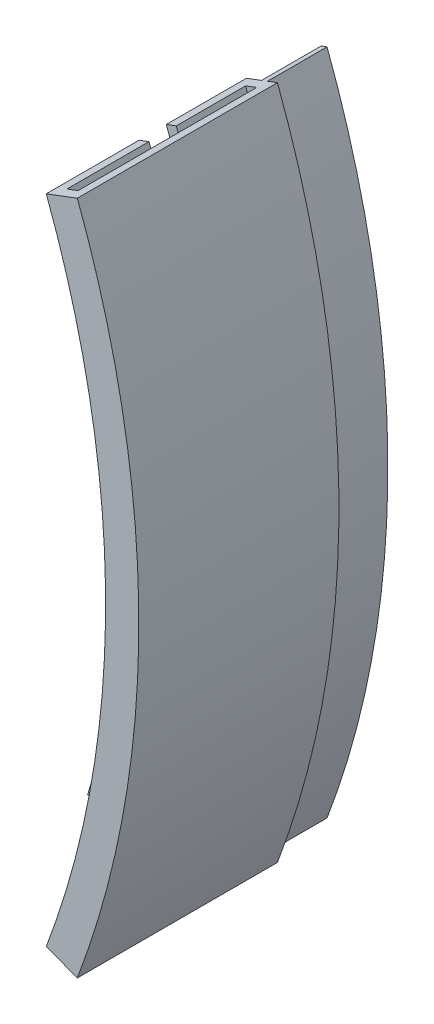
ISO-10303-21;
HEADER;
FILE_DESCRIPTION(('STEP AP214'),'2;1');
FILE_NAME('part.step','',(''),(''),'','','');
FILE_SCHEMA(('AUTOMOTIVE_DESIGN { 1 0 10303 214 1 1 1 1 }'));
ENDSEC;
DATA;
#1=APPLICATION_CONTEXT('core data for automotive mechanical design processes');
#2=APPLICATION_PROTOCOL_DEFINITION('international standard','automotive_design',2000,#1);
#3=PRODUCT_CONTEXT('',#1,'mechanical');
#4=PRODUCT('Part','Part','',(#3));
#5=PRODUCT_RELATED_PRODUCT_CATEGORY('part','',(#4));
#6=PRODUCT_DEFINITION_FORMATION('','',#4);
#7=PRODUCT_DEFINITION_CONTEXT('part definition',#1,'design');
#8=PRODUCT_DEFINITION('design','',#6,#7);
#9=PRODUCT_DEFINITION_SHAPE('','',#8);
#10=(LENGTH_UNIT() NAMED_UNIT(*) SI_UNIT(.MILLI.,.METRE.));
#11=(NAMED_UNIT(*) PLANE_ANGLE_UNIT() SI_UNIT($,.RADIAN.));
#12=(NAMED_UNIT(*) SI_UNIT($,.STERADIAN.) SOLID_ANGLE_UNIT());
#13=UNCERTAINTY_MEASURE_WITH_UNIT(LENGTH_MEASURE(1.E-05),#10,'distance_accuracy_value','');
#14=(GEOMETRIC_REPRESENTATION_CONTEXT(3) GLOBAL_UNCERTAINTY_ASSIGNED_CONTEXT((#13)) GLOBAL_UNIT_ASSIGNED_CONTEXT((#10,
#11,#12)) REPRESENTATION_CONTEXT('',''));
#15=CARTESIAN_POINT('',(0.,0.,0.));
#16=DIRECTION('',(0.,0.,1.));
#17=DIRECTION('',(1.,0.,0.));
#18=AXIS2_PLACEMENT_3D('',#15,#16,#17);
#19=CARTESIAN_POINT('',(210.,0.,72.79));
#20=DIRECTION('',(0.,0.,1.));
#21=DIRECTION('',(1.,0.,0.));
#22=AXIS2_PLACEMENT_3D('',#19,#20,#21);
#23=CYLINDRICAL_SURFACE('',#22,1.7);
#24=DIRECTION('',(0.,0.,1.));
#25=VECTOR('',#24,1.);
#26=CARTESIAN_POINT('',(211.7,0.,72.79));
#27=LINE('',#26,#25);
#28=CARTESIAN_POINT('',(211.7,0.,73.));
#29=VERTEX_POINT('',#28);
#30=CARTESIAN_POINT('',(211.7,0.,76.));
#31=VERTEX_POINT('',#30);
#32=EDGE_CURVE('E9',#29,#31,#27,.T.);
#33=ORIENTED_EDGE('',*,*,#32,.F.);
#34=CARTESIAN_POINT('',(210.,0.,73.));
#35=DIRECTION('',(0.,0.,1.));
#36=DIRECTION('',(1.,0.,0.));
#37=AXIS2_PLACEMENT_3D('',#34,#35,#36);
#38=CIRCLE('',#37,1.7);
#39=EDGE_CURVE('E402',#29,#29,#38,.T.);
#40=ORIENTED_EDGE('',*,*,#39,.F.);
#41=ORIENTED_EDGE('',*,*,#32,.T.);
#42=CARTESIAN_POINT('',(210.,0.,76.));
#43=DIRECTION('',(0.,0.,1.));
#44=DIRECTION('',(1.,0.,0.));
#45=AXIS2_PLACEMENT_3D('',#42,#43,#44);
#46=CIRCLE('',#45,1.7);
#47=EDGE_CURVE('E260',#31,#31,#46,.T.);
#48=ORIENTED_EDGE('',*,*,#47,.T.);
#49=EDGE_LOOP('',(#33,#40,#41,#48));
#50=FACE_BOUND('',#49,.T.);
#51=ADVANCED_FACE('F14',(#50),#23,.F.);
#52=CARTESIAN_POINT('',(202.22303845515,56.620161762074,72.79));
#53=DIRECTION('',(0.,0.,1.));
#54=DIRECTION('',(1.,0.,0.));
#55=AXIS2_PLACEMENT_3D('',#52,#53,#54);
#56=CYLINDRICAL_SURFACE('',#55,1.7);
#57=DIRECTION('',(0.,0.,1.));
#58=VECTOR('',#57,1.);
#59=CARTESIAN_POINT('',(203.92303845515,56.620161762074,72.79));
#60=LINE('',#59,#58);
#61=CARTESIAN_POINT('',(203.92303845515,56.620161762074,73.));
#62=VERTEX_POINT('',#61);
#63=CARTESIAN_POINT('',(203.92303845515,56.620161762074,76.));
#64=VERTEX_POINT('',#63);
#65=EDGE_CURVE('E24',#62,#64,#60,.T.);
#66=ORIENTED_EDGE('',*,*,#65,.F.);
#67=CARTESIAN_POINT('',(202.22303845515,56.620161762074,73.));
#68=DIRECTION('',(0.,0.,1.));
#69=DIRECTION('',(1.,0.,0.));
#70=AXIS2_PLACEMENT_3D('',#67,#68,#69);
#71=CIRCLE('',#70,1.7);
#72=EDGE_CURVE('E334',#62,#62,#71,.T.);
#73=ORIENTED_EDGE('',*,*,#72,.F.);
#74=ORIENTED_EDGE('',*,*,#65,.T.);
#75=CARTESIAN_POINT('',(202.22303845515,56.620161762074,76.));
#76=DIRECTION('',(0.,0.,1.));
#77=DIRECTION('',(1.,0.,0.));
#78=AXIS2_PLACEMENT_3D('',#75,#76,#77);
#79=CIRCLE('',#78,1.7);
#80=EDGE_CURVE('E305',#64,#64,#79,.T.);
#81=ORIENTED_EDGE('',*,*,#80,.T.);
#82=EDGE_LOOP('',(#66,#73,#74,#81));
#83=FACE_BOUND('',#82,.T.);
#84=ADVANCED_FACE('F851',(#83),#56,.F.);
#85=CARTESIAN_POINT('',(202.22303845515,-56.62016176207,72.79));
#86=DIRECTION('',(0.,0.,1.));
#87=DIRECTION('',(1.,0.,0.));
#88=AXIS2_PLACEMENT_3D('',#85,#86,#87);
#89=CYLINDRICAL_SURFACE('',#88,1.7);
#90=DIRECTION('',(0.,0.,1.));
#91=VECTOR('',#90,1.);
#92=CARTESIAN_POINT('',(203.92303845515,-56.62016176207,72.79));
#93=LINE('',#92,#91);
#94=CARTESIAN_POINT('',(203.92303845515,-56.62016176207,73.));
#95=VERTEX_POINT('',#94);
#96=CARTESIAN_POINT('',(203.92303845515,-56.62016176207,76.));
#97=VERTEX_POINT('',#96);
#98=EDGE_CURVE('E331',#95,#97,#93,.T.);
#99=ORIENTED_EDGE('',*,*,#98,.F.);
#100=CARTESIAN_POINT('',(202.22303845515,-56.62016176207,73.));
#101=DIRECTION('',(0.,0.,1.));
#102=DIRECTION('',(1.,0.,0.));
#103=AXIS2_PLACEMENT_3D('',#100,#101,#102);
#104=CIRCLE('',#103,1.7);
#105=EDGE_CURVE('E259',#95,#95,#104,.T.);
#106=ORIENTED_EDGE('',*,*,#105,.F.);
#107=ORIENTED_EDGE('',*,*,#98,.T.);
#108=CARTESIAN_POINT('',(202.22303845515,-56.62016176207,76.));
#109=DIRECTION('',(0.,0.,1.));
#110=DIRECTION('',(1.,0.,0.));
#111=AXIS2_PLACEMENT_3D('',#108,#109,#110);
#112=CIRCLE('',#111,1.7);
#113=EDGE_CURVE('E308',#97,#97,#112,.T.);
#114=ORIENTED_EDGE('',*,*,#113,.T.);
#115=EDGE_LOOP('',(#99,#106,#107,#114));
#116=FACE_BOUND('',#115,.T.);
#117=ADVANCED_FACE('F859',(#116),#89,.F.);
#118=CARTESIAN_POINT('',(0.,0.,76.));
#119=DIRECTION('',(0.,0.,-1.));
#120=DIRECTION('',(0.955579041061321,-0.294734959386099,0.));
#121=AXIS2_PLACEMENT_3D('',#118,#119,#120);
#122=CYLINDRICAL_SURFACE('',#121,203.);
#123=CARTESIAN_POINT('',(0.,0.,76.));
#124=DIRECTION('',(0.,0.,1.));
#125=DIRECTION('',(0.955579041061321,-0.294734959386099,0.));
#126=AXIS2_PLACEMENT_3D('',#123,#124,#125);
#127=CIRCLE('',#126,203.);
#128=CARTESIAN_POINT('',(193.98254533545,-59.83119675535,76.));
#129=VERTEX_POINT('',#128);
#130=CARTESIAN_POINT('',(193.98254533545,59.831196755358,76.));
#131=VERTEX_POINT('',#130);
#132=EDGE_CURVE('E270',#129,#131,#127,.T.);
#133=ORIENTED_EDGE('',*,*,#132,.T.);
#134=DIRECTION('',(0.,0.,-1.));
#135=VECTOR('',#134,1.);
#136=CARTESIAN_POINT('',(193.98254533545,59.831196755358,76.));
#137=LINE('',#136,#135);
#138=CARTESIAN_POINT('',(193.98254533545,59.831196755358,73.));
#139=VERTEX_POINT('',#138);
#140=EDGE_CURVE('E255',#131,#139,#137,.T.);
#141=ORIENTED_EDGE('',*,*,#140,.T.);
#142=CARTESIAN_POINT('',(0.,0.,73.));
#143=DIRECTION('',(0.,0.,1.));
#144=DIRECTION('',(0.955579041061321,-0.294734959386099,0.));
#145=AXIS2_PLACEMENT_3D('',#142,#143,#144);
#146=CIRCLE('',#145,203.);
#147=CARTESIAN_POINT('',(193.98254533545,-59.83119675535,73.));
#148=VERTEX_POINT('',#147);
#149=EDGE_CURVE('E248',#148,#139,#146,.T.);
#150=ORIENTED_EDGE('',*,*,#149,.F.);
#151=DIRECTION('',(0.,0.,-1.));
#152=VECTOR('',#151,1.);
#153=CARTESIAN_POINT('',(193.98254533545,-59.83119675535,76.));
#154=LINE('',#153,#152);
#155=EDGE_CURVE('E252',#129,#148,#154,.T.);
#156=ORIENTED_EDGE('',*,*,#155,.F.);
#157=EDGE_LOOP('',(#133,#141,#150,#156));
#158=FACE_BOUND('',#157,.T.);
#159=ADVANCED_FACE('F250',(#158),#122,.F.);
#160=CARTESIAN_POINT('',(0.,0.,73.));
#161=DIRECTION('',(0.,0.,1.));
#162=DIRECTION('',(1.,0.,0.));
#163=AXIS2_PLACEMENT_3D('',#160,#161,#162);
#164=PLANE('',#163);
#165=ORIENTED_EDGE('',*,*,#72,.T.);
#166=EDGE_LOOP('',(#165));
#167=FACE_BOUND('',#166,.T.);
#168=ORIENTED_EDGE('',*,*,#39,.T.);
#169=EDGE_LOOP('',(#168));
#170=FACE_BOUND('',#169,.T.);
#171=ORIENTED_EDGE('',*,*,#105,.T.);
#172=EDGE_LOOP('',(#171));
#173=FACE_BOUND('',#172,.T.);
#174=DIRECTION('',(0.955579041061321,-0.294734959386099,0.));
#175=VECTOR('',#174,1.);
#176=CARTESIAN_POINT('',(193.98254533545,-59.83119675535,73.));
#177=LINE('',#176,#175);
#178=CARTESIAN_POINT('',(207.45620981442,-63.9869596827,73.));
#179=VERTEX_POINT('',#178);
#180=EDGE_CURVE('E263',#148,#179,#177,.T.);
#181=ORIENTED_EDGE('',*,*,#180,.F.);
#182=ORIENTED_EDGE('',*,*,#149,.T.);
#183=DIRECTION('',(0.955579041061321,0.294734959386099,0.));
#184=VECTOR('',#183,1.);
#185=CARTESIAN_POINT('',(193.98254533545,59.831196755358,73.));
#186=LINE('',#185,#184);
#187=CARTESIAN_POINT('',(207.45620981442,63.9869596827,73.));
#188=VERTEX_POINT('',#187);
#189=EDGE_CURVE('E348',#139,#188,#186,.T.);
#190=ORIENTED_EDGE('',*,*,#189,.T.);
#191=CARTESIAN_POINT('',(0.,0.,73.));
#192=DIRECTION('',(0.,0.,-1.));
#193=DIRECTION('',(0.929508671393353,-0.36880025732714,0.));
#194=AXIS2_PLACEMENT_3D('',#191,#192,#193);
#195=CIRCLE('',#194,217.1);
#196=EDGE_CURVE('E266',#188,#179,#195,.T.);
#197=ORIENTED_EDGE('',*,*,#196,.T.);
#198=EDGE_LOOP('',(#181,#182,#190,#197));
#199=FACE_BOUND('',#198,.T.);
#200=ADVANCED_FACE('F264',(#167,#170,#173,#199),#164,.F.);
#201=CARTESIAN_POINT('',(0.,0.,76.));
#202=DIRECTION('',(0.,0.,1.));
#203=DIRECTION('',(1.,0.,0.));
#204=AXIS2_PLACEMENT_3D('',#201,#202,#203);
#205=PLANE('',#204);
#206=ORIENTED_EDGE('',*,*,#47,.F.);
#207=EDGE_LOOP('',(#206));
#208=FACE_BOUND('',#207,.T.);
#209=ORIENTED_EDGE('',*,*,#80,.F.);
#210=EDGE_LOOP('',(#209));
#211=FACE_BOUND('',#210,.T.);
#212=ORIENTED_EDGE('',*,*,#113,.F.);
#213=EDGE_LOOP('',(#212));
#214=FACE_BOUND('',#213,.T.);
#215=DIRECTION('',(-0.955579041061321,0.294734959386099,0.));
#216=VECTOR('',#215,1.);
#217=CARTESIAN_POINT('',(208.02955723905,-64.16380065833,76.));
#218=LINE('',#217,#216);
#219=CARTESIAN_POINT('',(207.55176771852,-64.01643317863,76.));
#220=VERTEX_POINT('',#219);
#221=EDGE_CURVE('E274',#220,#129,#218,.T.);
#222=ORIENTED_EDGE('',*,*,#221,.F.);
#223=CARTESIAN_POINT('',(0.,0.,76.));
#224=DIRECTION('',(0.,0.,-1.));
#225=DIRECTION('',(0.935803554705331,-0.352521924142125,0.));
#226=AXIS2_PLACEMENT_3D('',#223,#224,#225);
#227=CIRCLE('',#226,217.2);
#228=CARTESIAN_POINT('',(207.55176771852,64.016433178639,76.));
#229=VERTEX_POINT('',#228);
#230=EDGE_CURVE('E351',#229,#220,#227,.T.);
#231=ORIENTED_EDGE('',*,*,#230,.F.);
#232=DIRECTION('',(-0.955579041061321,-0.294734959386099,0.));
#233=VECTOR('',#232,1.);
#234=CARTESIAN_POINT('',(208.02955723905,64.163800658332,76.));
#235=LINE('',#234,#233);
#236=EDGE_CURVE('E281',#229,#131,#235,.T.);
#237=ORIENTED_EDGE('',*,*,#236,.T.);
#238=ORIENTED_EDGE('',*,*,#132,.F.);
#239=EDGE_LOOP('',(#222,#231,#237,#238));
#240=FACE_BOUND('',#239,.T.);
#241=ADVANCED_FACE('F791',(#208,#211,#214,#240),#205,.T.);
#242=CARTESIAN_POINT('',(201.00605128725,-61.99749870684,74.5));
#243=DIRECTION('',(-0.294734959386099,-0.955579041061321,0.));
#244=DIRECTION('',(-0.955579041061321,0.294734959386099,0.));
#245=AXIS2_PLACEMENT_3D('',#242,#243,#244);
#246=PLANE('',#245);
#247=ORIENTED_EDGE('',*,*,#221,.T.);
#248=ORIENTED_EDGE('',*,*,#155,.T.);
#249=ORIENTED_EDGE('',*,*,#180,.T.);
#250=DIRECTION('',(0.,0.,-1.));
#251=VECTOR('',#250,1.);
#252=CARTESIAN_POINT('',(207.45620981442,-63.9869596827,73.2));
#253=LINE('',#252,#251);
#254=CARTESIAN_POINT('',(207.45620981442,-63.9869596827,73.2));
#255=VERTEX_POINT('',#254);
#256=EDGE_CURVE('E296',#255,#179,#253,.T.);
#257=ORIENTED_EDGE('',*,*,#256,.F.);
#258=DIRECTION('',(-0.955579041061321,0.294734959386099,0.));
#259=VECTOR('',#258,1.);
#260=CARTESIAN_POINT('',(100.50302564362,-30.99874935342,73.2));
#261=LINE('',#260,#259);
#262=CARTESIAN_POINT('',(207.55176771852,-64.01643317863,73.2));
#263=VERTEX_POINT('',#262);
#264=EDGE_CURVE('E441',#263,#255,#261,.T.);
#265=ORIENTED_EDGE('',*,*,#264,.F.);
#266=DIRECTION('',(0.,0.,-1.));
#267=VECTOR('',#266,1.);
#268=CARTESIAN_POINT('',(207.55176771852,-64.01643317863,95.));
#269=LINE('',#268,#267);
#270=EDGE_CURVE('E355',#220,#263,#269,.T.);
#271=ORIENTED_EDGE('',*,*,#270,.F.);
#272=EDGE_LOOP('',(#247,#248,#249,#257,#265,#271));
#273=FACE_BOUND('',#272,.T.);
#274=ADVANCED_FACE('F272',(#273),#246,.T.);
#275=CARTESIAN_POINT('',(201.00605128725,61.997498706845,74.5));
#276=DIRECTION('',(0.294734959386099,-0.955579041061321,0.));
#277=DIRECTION('',(0.,0.,-1.));
#278=AXIS2_PLACEMENT_3D('',#275,#276,#277);
#279=PLANE('',#278);
#280=DIRECTION('',(0.,0.,-1.));
#281=VECTOR('',#280,1.);
#282=CARTESIAN_POINT('',(207.55176771852,64.016433178639,95.));
#283=LINE('',#282,#281);
#284=CARTESIAN_POINT('',(207.55176771852,64.016433178639,73.2));
#285=VERTEX_POINT('',#284);
#286=EDGE_CURVE('E356',#229,#285,#283,.T.);
#287=ORIENTED_EDGE('',*,*,#286,.T.);
#288=DIRECTION('',(-0.955579041061321,-0.294734959386099,0.));
#289=VECTOR('',#288,1.);
#290=CARTESIAN_POINT('',(100.50302564362,30.998749353422,73.2));
#291=LINE('',#290,#289);
#292=CARTESIAN_POINT('',(207.45620981442,63.9869596827,73.2));
#293=VERTEX_POINT('',#292);
#294=EDGE_CURVE('E361',#285,#293,#291,.T.);
#295=ORIENTED_EDGE('',*,*,#294,.T.);
#296=DIRECTION('',(0.,0.,-1.));
#297=VECTOR('',#296,1.);
#298=CARTESIAN_POINT('',(207.45620981442,63.9869596827,73.2));
#299=LINE('',#298,#297);
#300=EDGE_CURVE('E292',#293,#188,#299,.T.);
#301=ORIENTED_EDGE('',*,*,#300,.T.);
#302=ORIENTED_EDGE('',*,*,#189,.F.);
#303=ORIENTED_EDGE('',*,*,#140,.F.);
#304=ORIENTED_EDGE('',*,*,#236,.F.);
#305=EDGE_LOOP('',(#287,#295,#301,#302,#303,#304));
#306=FACE_BOUND('',#305,.T.);
#307=ADVANCED_FACE('F800',(#306),#279,.F.);
#308=CARTESIAN_POINT('',(0.,0.,73.2));
#309=DIRECTION('',(0.,0.,-1.));
#310=DIRECTION('',(0.929508671393353,-0.36880025732714,0.));
#311=AXIS2_PLACEMENT_3D('',#308,#309,#310);
#312=CYLINDRICAL_SURFACE('',#311,217.1);
#313=ORIENTED_EDGE('',*,*,#196,.F.);
#314=ORIENTED_EDGE('',*,*,#300,.F.);
#315=CARTESIAN_POINT('',(0.,0.,73.2));
#316=DIRECTION('',(0.,0.,1.));
#317=DIRECTION('',(0.929508671393353,-0.36880025732714,0.));
#318=AXIS2_PLACEMENT_3D('',#315,#316,#317);
#319=CIRCLE('',#318,217.1);
#320=EDGE_CURVE('E424',#255,#293,#319,.T.);
#321=ORIENTED_EDGE('',*,*,#320,.F.);
#322=ORIENTED_EDGE('',*,*,#256,.T.);
#323=EDGE_LOOP('',(#313,#314,#321,#322));
#324=FACE_BOUND('',#323,.T.);
#325=ADVANCED_FACE('F804',(#324),#312,.T.);
#326=CARTESIAN_POINT('',(0.,0.,95.));
#327=DIRECTION('',(0.,0.,-1.));
#328=DIRECTION('',(0.935803554705331,-0.352521924142125,0.));
#329=AXIS2_PLACEMENT_3D('',#326,#327,#328);
#330=CYLINDRICAL_SURFACE('',#329,217.2);
#331=DIRECTION('',(0.,0.,-1.));
#332=VECTOR('',#331,1.);
#333=CARTESIAN_POINT('',(203.25653208204,-76.56776192354,95.));
#334=LINE('',#333,#332);
#335=CARTESIAN_POINT('',(203.25653208204,-76.56776192354,95.));
#336=VERTEX_POINT('',#335);
#337=CARTESIAN_POINT('',(203.25653208204,-76.56776192354,73.2));
#338=VERTEX_POINT('',#337);
#339=EDGE_CURVE('E18',#336,#338,#334,.T.);
#340=ORIENTED_EDGE('',*,*,#339,.F.);
#341=CARTESIAN_POINT('',(0.,0.,95.));
#342=DIRECTION('',(0.,0.,1.));
#343=DIRECTION('',(0.935803554705331,-0.352521924142125,0.));
#344=AXIS2_PLACEMENT_3D('',#341,#342,#343);
#345=CIRCLE('',#344,217.2);
#346=CARTESIAN_POINT('',(203.25653208204,76.567761923541,95.));
#347=VERTEX_POINT('',#346);
#348=EDGE_CURVE('E416',#336,#347,#345,.T.);
#349=ORIENTED_EDGE('',*,*,#348,.T.);
#350=DIRECTION('',(0.,0.,-1.));
#351=VECTOR('',#350,1.);
#352=CARTESIAN_POINT('',(203.25653208204,76.567761923541,95.));
#353=LINE('',#352,#351);
#354=CARTESIAN_POINT('',(203.25653208204,76.567761923541,73.2));
#355=VERTEX_POINT('',#354);
#356=EDGE_CURVE('E395',#347,#355,#353,.T.);
#357=ORIENTED_EDGE('',*,*,#356,.T.);
#358=CARTESIAN_POINT('',(0.,0.,73.2));
#359=DIRECTION('',(0.,0.,-1.));
#360=DIRECTION('',(0.935803554705331,-0.352521924142125,0.));
#361=AXIS2_PLACEMENT_3D('',#358,#359,#360);
#362=CIRCLE('',#361,217.2);
#363=EDGE_CURVE('E64',#355,#285,#362,.T.);
#364=ORIENTED_EDGE('',*,*,#363,.T.);
#365=ORIENTED_EDGE('',*,*,#286,.F.);
#366=ORIENTED_EDGE('',*,*,#230,.T.);
#367=ORIENTED_EDGE('',*,*,#270,.T.);
#368=CARTESIAN_POINT('',(0.,0.,73.2));
#369=DIRECTION('',(0.,0.,-1.));
#370=DIRECTION('',(0.935803554705331,-0.352521924142125,0.));
#371=AXIS2_PLACEMENT_3D('',#368,#369,#370);
#372=CIRCLE('',#371,217.2);
#373=EDGE_CURVE('E438',#263,#338,#372,.T.);
#374=ORIENTED_EDGE('',*,*,#373,.T.);
#375=EDGE_LOOP('',(#340,#349,#357,#364,#365,#366,#367,#374));
#376=FACE_BOUND('',#375,.T.);
#377=ADVANCED_FACE('F842',(#376),#330,.F.);
#378=CARTESIAN_POINT('',(0.,0.,73.2));
#379=DIRECTION('',(0.,0.,1.));
#380=DIRECTION('',(1.,0.,0.));
#381=AXIS2_PLACEMENT_3D('',#378,#379,#380);
#382=PLANE('',#381);
#383=ORIENTED_EDGE('',*,*,#294,.F.);
#384=ORIENTED_EDGE('',*,*,#363,.F.);
#385=DIRECTION('',(-0.935803554705331,-0.352521924142125,0.));
#386=VECTOR('',#385,1.);
#387=CARTESIAN_POINT('',(103.45308297269,38.971298713847,73.2));
#388=LINE('',#387,#386);
#389=CARTESIAN_POINT('',(205.59604096881,77.449066733895,73.2));
#390=VERTEX_POINT('',#389);
#391=EDGE_CURVE('E387',#390,#355,#388,.T.);
#392=ORIENTED_EDGE('',*,*,#391,.F.);
#393=CARTESIAN_POINT('',(0.,0.,73.2));
#394=DIRECTION('',(0.,0.,-1.));
#395=DIRECTION('',(0.929508671393352,-0.36880025732714,0.));
#396=AXIS2_PLACEMENT_3D('',#393,#394,#395);
#397=CIRCLE('',#396,219.7);
#398=CARTESIAN_POINT('',(205.59604096881,-77.44906673389,73.2));
#399=VERTEX_POINT('',#398);
#400=EDGE_CURVE('E81',#390,#399,#397,.T.);
#401=ORIENTED_EDGE('',*,*,#400,.T.);
#402=DIRECTION('',(-0.935803554705331,0.352521924142125,0.));
#403=VECTOR('',#402,1.);
#404=CARTESIAN_POINT('',(103.45308297269,-38.97129871384,73.2));
#405=LINE('',#404,#403);
#406=EDGE_CURVE('E345',#399,#338,#405,.T.);
#407=ORIENTED_EDGE('',*,*,#406,.T.);
#408=ORIENTED_EDGE('',*,*,#373,.F.);
#409=ORIENTED_EDGE('',*,*,#264,.T.);
#410=ORIENTED_EDGE('',*,*,#320,.T.);
#411=EDGE_LOOP('',(#383,#384,#392,#401,#407,#408,#409,#410));
#412=FACE_BOUND('',#411,.T.);
#413=ADVANCED_FACE('F555',(#412),#382,.F.);
#414=CARTESIAN_POINT('',(0.,0.,92.5));
#415=DIRECTION('',(0.,0.,-1.));
#416=DIRECTION('',(0.929508671393353,-0.36880025732714,0.));
#417=AXIS2_PLACEMENT_3D('',#414,#415,#416);
#418=CYLINDRICAL_SURFACE('',#417,219.7);
#419=ORIENTED_EDGE('',*,*,#400,.F.);
#420=DIRECTION('',(0.,0.,-1.));
#421=VECTOR('',#420,1.);
#422=CARTESIAN_POINT('',(205.59604096881,77.449066733895,92.5));
#423=LINE('',#422,#421);
#424=CARTESIAN_POINT('',(205.59604096881,77.449066733895,92.5));
#425=VERTEX_POINT('',#424);
#426=EDGE_CURVE('E338',#425,#390,#423,.T.);
#427=ORIENTED_EDGE('',*,*,#426,.F.);
#428=CARTESIAN_POINT('',(0.,0.,92.5));
#429=DIRECTION('',(0.,0.,1.));
#430=DIRECTION('',(0.929508671393352,-0.36880025732714,0.));
#431=AXIS2_PLACEMENT_3D('',#428,#429,#430);
#432=CIRCLE('',#431,219.7);
#433=CARTESIAN_POINT('',(205.59604096881,-77.44906673389,92.5));
#434=VERTEX_POINT('',#433);
#435=EDGE_CURVE('E300',#434,#425,#432,.T.);
#436=ORIENTED_EDGE('',*,*,#435,.F.);
#437=DIRECTION('',(0.,0.,-1.));
#438=VECTOR('',#437,1.);
#439=CARTESIAN_POINT('',(205.59604096881,-77.44906673389,92.5));
#440=LINE('',#439,#438);
#441=EDGE_CURVE('E341',#434,#399,#440,.T.);
#442=ORIENTED_EDGE('',*,*,#441,.T.);
#443=EDGE_LOOP('',(#419,#427,#436,#442));
#444=FACE_BOUND('',#443,.T.);
#445=ADVANCED_FACE('F540',(#444),#418,.T.);
#446=CARTESIAN_POINT('',(0.,0.,92.5));
#447=DIRECTION('',(0.,0.,1.));
#448=DIRECTION('',(1.,0.,0.));
#449=AXIS2_PLACEMENT_3D('',#446,#447,#448);
#450=PLANE('',#449);
#451=ORIENTED_EDGE('',*,*,#435,.T.);
#452=DIRECTION('',(-0.935803554705331,-0.352521924142125,0.));
#453=VECTOR('',#452,1.);
#454=CARTESIAN_POINT('',(103.45308297269,38.971298713847,92.5));
#455=LINE('',#454,#453);
#456=CARTESIAN_POINT('',(208.21629092198,78.436128121492,92.5));
#457=VERTEX_POINT('',#456);
#458=EDGE_CURVE('E335',#457,#425,#455,.T.);
#459=ORIENTED_EDGE('',*,*,#458,.F.);
#460=CARTESIAN_POINT('',(0.,0.,92.5));
#461=DIRECTION('',(0.,0.,1.));
#462=DIRECTION('',(0.929508671393352,-0.36880025732714,0.));
#463=AXIS2_PLACEMENT_3D('',#460,#461,#462);
#464=CIRCLE('',#463,222.5);
#465=CARTESIAN_POINT('',(208.21629092198,-78.43612812149,92.5));
#466=VERTEX_POINT('',#465);
#467=EDGE_CURVE('E297',#466,#457,#464,.T.);
#468=ORIENTED_EDGE('',*,*,#467,.F.);
#469=DIRECTION('',(-0.935803554705331,0.352521924142125,0.));
#470=VECTOR('',#469,1.);
#471=CARTESIAN_POINT('',(103.45308297269,-38.97129871384,92.5));
#472=LINE('',#471,#470);
#473=EDGE_CURVE('E344',#466,#434,#472,.T.);
#474=ORIENTED_EDGE('',*,*,#473,.T.);
#475=EDGE_LOOP('',(#451,#459,#468,#474));
#476=FACE_BOUND('',#475,.T.);
#477=ADVANCED_FACE('F537',(#476),#450,.F.);
#478=CARTESIAN_POINT('',(0.,0.,50.5));
#479=DIRECTION('',(0.,0.,1.));
#480=DIRECTION('',(0.929508671393352,-0.36880025732714,0.));
#481=AXIS2_PLACEMENT_3D('',#478,#479,#480);
#482=CYLINDRICAL_SURFACE('',#481,222.5);
#483=ORIENTED_EDGE('',*,*,#467,.T.);
#484=DIRECTION('',(0.,0.,1.));
#485=VECTOR('',#484,1.);
#486=CARTESIAN_POINT('',(208.21629092198,78.436128121492,50.5));
#487=LINE('',#486,#485);
#488=CARTESIAN_POINT('',(208.21629092198,78.436128121492,50.5));
#489=VERTEX_POINT('',#488);
#490=EDGE_CURVE('E339',#489,#457,#487,.T.);
#491=ORIENTED_EDGE('',*,*,#490,.F.);
#492=CARTESIAN_POINT('',(0.,0.,50.5));
#493=DIRECTION('',(0.,0.,1.));
#494=DIRECTION('',(0.929508671393352,-0.36880025732714,0.));
#495=AXIS2_PLACEMENT_3D('',#492,#493,#494);
#496=CIRCLE('',#495,222.5);
#497=CARTESIAN_POINT('',(208.21629092198,-78.43612812149,50.5));
#498=VERTEX_POINT('',#497);
#499=EDGE_CURVE('E301',#498,#489,#496,.T.);
#500=ORIENTED_EDGE('',*,*,#499,.F.);
#501=DIRECTION('',(0.,0.,1.));
#502=VECTOR('',#501,1.);
#503=CARTESIAN_POINT('',(208.21629092198,-78.43612812149,50.5));
#504=LINE('',#503,#502);
#505=EDGE_CURVE('E368',#498,#466,#504,.T.);
#506=ORIENTED_EDGE('',*,*,#505,.T.);
#507=EDGE_LOOP('',(#483,#491,#500,#506));
#508=FACE_BOUND('',#507,.T.);
#509=ADVANCED_FACE('F16',(#508),#482,.F.);
#510=CARTESIAN_POINT('',(0.,0.,50.5));
#511=DIRECTION('',(0.,0.,1.));
#512=DIRECTION('',(1.,0.,0.));
#513=AXIS2_PLACEMENT_3D('',#510,#511,#512);
#514=PLANE('',#513);
#515=ORIENTED_EDGE('',*,*,#499,.T.);
#516=DIRECTION('',(0.935803554705331,0.352521924142125,0.));
#517=VECTOR('',#516,1.);
#518=CARTESIAN_POINT('',(103.45308297269,38.971298713847,50.5));
#519=LINE('',#518,#517);
#520=CARTESIAN_POINT('',(205.59604096881,77.449066733895,50.5));
#521=VERTEX_POINT('',#520);
#522=EDGE_CURVE('E417',#521,#489,#519,.T.);
#523=ORIENTED_EDGE('',*,*,#522,.F.);
#524=CARTESIAN_POINT('',(0.,0.,50.5));
#525=DIRECTION('',(0.,0.,1.));
#526=DIRECTION('',(0.929508671393352,-0.36880025732714,0.));
#527=AXIS2_PLACEMENT_3D('',#524,#525,#526);
#528=CIRCLE('',#527,219.7);
#529=CARTESIAN_POINT('',(205.59604096881,-77.44906673389,50.5));
#530=VERTEX_POINT('',#529);
#531=EDGE_CURVE('E290',#530,#521,#528,.T.);
#532=ORIENTED_EDGE('',*,*,#531,.F.);
#533=DIRECTION('',(0.935803554705331,-0.352521924142125,0.));
#534=VECTOR('',#533,1.);
#535=CARTESIAN_POINT('',(103.45308297269,-38.97129871384,50.5));
#536=LINE('',#535,#534);
#537=EDGE_CURVE('E285',#530,#498,#536,.T.);
#538=ORIENTED_EDGE('',*,*,#537,.T.);
#539=EDGE_LOOP('',(#515,#523,#532,#538));
#540=FACE_BOUND('',#539,.T.);
#541=ADVANCED_FACE('F763',(#540),#514,.T.);
#542=CARTESIAN_POINT('',(0.,0.,92.5));
#543=DIRECTION('',(0.,0.,-1.));
#544=DIRECTION('',(0.929508671393353,-0.36880025732714,0.));
#545=AXIS2_PLACEMENT_3D('',#542,#543,#544);
#546=CYLINDRICAL_SURFACE('',#545,219.7);
#547=ORIENTED_EDGE('',*,*,#531,.T.);
#548=DIRECTION('',(0.,0.,-1.));
#549=VECTOR('',#548,1.);
#550=CARTESIAN_POINT('',(205.59604096881,77.449066733895,92.5));
#551=LINE('',#550,#549);
#552=CARTESIAN_POINT('',(205.59604096881,77.449066733895,66.8));
#553=VERTEX_POINT('',#552);
#554=EDGE_CURVE('E421',#553,#521,#551,.T.);
#555=ORIENTED_EDGE('',*,*,#554,.F.);
#556=CARTESIAN_POINT('',(0.,0.,66.8));
#557=DIRECTION('',(0.,0.,-1.));
#558=DIRECTION('',(0.929508671393352,-0.36880025732714,0.));
#559=AXIS2_PLACEMENT_3D('',#556,#557,#558);
#560=CIRCLE('',#559,219.7);
#561=CARTESIAN_POINT('',(205.59604096881,-77.44906673389,66.8));
#562=VERTEX_POINT('',#561);
#563=EDGE_CURVE('E287',#553,#562,#560,.T.);
#564=ORIENTED_EDGE('',*,*,#563,.T.);
#565=DIRECTION('',(0.,0.,-1.));
#566=VECTOR('',#565,1.);
#567=CARTESIAN_POINT('',(205.59604096881,-77.44906673389,92.5));
#568=LINE('',#567,#566);
#569=EDGE_CURVE('E437',#562,#530,#568,.T.);
#570=ORIENTED_EDGE('',*,*,#569,.T.);
#571=EDGE_LOOP('',(#547,#555,#564,#570));
#572=FACE_BOUND('',#571,.T.);
#573=ADVANCED_FACE('F911',(#572),#546,.T.);
#574=CARTESIAN_POINT('',(0.,0.,66.8));
#575=DIRECTION('',(0.,0.,1.));
#576=DIRECTION('',(1.,0.,0.));
#577=AXIS2_PLACEMENT_3D('',#574,#575,#576);
#578=PLANE('',#577);
#579=ORIENTED_EDGE('',*,*,#563,.F.);
#580=DIRECTION('',(0.935803554705331,0.352521924142125,0.));
#581=VECTOR('',#580,1.);
#582=CARTESIAN_POINT('',(103.45308297269,38.971298713847,66.8));
#583=LINE('',#582,#581);
#584=CARTESIAN_POINT('',(203.25653208204,76.567761923541,66.8));
#585=VERTEX_POINT('',#584);
#586=EDGE_CURVE('E313',#585,#553,#583,.T.);
#587=ORIENTED_EDGE('',*,*,#586,.F.);
#588=CARTESIAN_POINT('',(0.,0.,66.8));
#589=DIRECTION('',(0.,0.,-1.));
#590=DIRECTION('',(0.935803554705331,-0.352521924142125,0.));
#591=AXIS2_PLACEMENT_3D('',#588,#589,#590);
#592=CIRCLE('',#591,217.2);
#593=CARTESIAN_POINT('',(203.25653208204,-76.56776192354,66.8));
#594=VERTEX_POINT('',#593);
#595=EDGE_CURVE('E394',#585,#594,#592,.T.);
#596=ORIENTED_EDGE('',*,*,#595,.T.);
#597=DIRECTION('',(0.935803554705331,-0.352521924142125,0.));
#598=VECTOR('',#597,1.);
#599=CARTESIAN_POINT('',(103.45308297269,-38.97129871384,66.8));
#600=LINE('',#599,#598);
#601=EDGE_CURVE('E319',#594,#562,#600,.T.);
#602=ORIENTED_EDGE('',*,*,#601,.T.);
#603=EDGE_LOOP('',(#579,#587,#596,#602));
#604=FACE_BOUND('',#603,.T.);
#605=ADVANCED_FACE('F833',(#604),#578,.T.);
#606=CARTESIAN_POINT('',(0.,0.,34.));
#607=DIRECTION('',(0.,0.,1.));
#608=DIRECTION('',(1.,0.,0.));
#609=AXIS2_PLACEMENT_3D('',#606,#607,#608);
#610=PLANE('',#609);
#611=CARTESIAN_POINT('',(0.,0.,34.));
#612=DIRECTION('',(0.,0.,1.));
#613=DIRECTION('',(0.935803554705331,-0.352521924142125,0.));
#614=AXIS2_PLACEMENT_3D('',#611,#612,#613);
#615=CIRCLE('',#614,221.);
#616=CARTESIAN_POINT('',(206.81258558992,-77.90734523527,34.));
#617=VERTEX_POINT('',#616);
#618=CARTESIAN_POINT('',(206.81258558992,77.907345235279,34.));
#619=VERTEX_POINT('',#618);
#620=EDGE_CURVE('E374',#617,#619,#615,.T.);
#621=ORIENTED_EDGE('',*,*,#620,.T.);
#622=DIRECTION('',(0.935803554705331,0.352521924142125,0.));
#623=VECTOR('',#622,1.);
#624=CARTESIAN_POINT('',(206.81258558992,77.907345235279,34.));
#625=LINE('',#624,#623);
#626=CARTESIAN_POINT('',(208.21629092198,78.436128121492,34.));
#627=VERTEX_POINT('',#626);
#628=EDGE_CURVE('E314',#619,#627,#625,.T.);
#629=ORIENTED_EDGE('',*,*,#628,.T.);
#630=CARTESIAN_POINT('',(0.,0.,34.));
#631=DIRECTION('',(0.,0.,1.));
#632=DIRECTION('',(0.935803554705331,-0.352521924142125,0.));
#633=AXIS2_PLACEMENT_3D('',#630,#631,#632);
#634=CIRCLE('',#633,222.5);
#635=CARTESIAN_POINT('',(208.21629092198,-78.43612812149,34.));
#636=VERTEX_POINT('',#635);
#637=EDGE_CURVE('E291',#636,#627,#634,.T.);
#638=ORIENTED_EDGE('',*,*,#637,.F.);
#639=DIRECTION('',(0.935803554705331,-0.352521924142125,0.));
#640=VECTOR('',#639,1.);
#641=CARTESIAN_POINT('',(206.81258558992,-77.90734523527,34.));
#642=LINE('',#641,#640);
#643=EDGE_CURVE('E470',#617,#636,#642,.T.);
#644=ORIENTED_EDGE('',*,*,#643,.F.);
#645=EDGE_LOOP('',(#621,#629,#638,#644));
#646=FACE_BOUND('',#645,.T.);
#647=ADVANCED_FACE('F815',(#646),#610,.F.);
#648=CARTESIAN_POINT('',(0.,0.,34.));
#649=DIRECTION('',(0.,0.,1.));
#650=DIRECTION('',(0.935803554705331,-0.352521924142125,0.));
#651=AXIS2_PLACEMENT_3D('',#648,#649,#650);
#652=CYLINDRICAL_SURFACE('',#651,222.5);
#653=DIRECTION('',(0.,0.,1.));
#654=VECTOR('',#653,1.);
#655=CARTESIAN_POINT('',(208.21629092198,-78.43612812149,34.));
#656=LINE('',#655,#654);
#657=CARTESIAN_POINT('',(208.21629092198,-78.43612812149,48.));
#658=VERTEX_POINT('',#657);
#659=EDGE_CURVE('E429',#636,#658,#656,.T.);
#660=ORIENTED_EDGE('',*,*,#659,.F.);
#661=ORIENTED_EDGE('',*,*,#637,.T.);
#662=DIRECTION('',(0.,0.,1.));
#663=VECTOR('',#662,1.);
#664=CARTESIAN_POINT('',(208.21629092198,78.436128121492,34.));
#665=LINE('',#664,#663);
#666=CARTESIAN_POINT('',(208.21629092198,78.436128121492,48.));
#667=VERTEX_POINT('',#666);
#668=EDGE_CURVE('E360',#627,#667,#665,.T.);
#669=ORIENTED_EDGE('',*,*,#668,.T.);
#670=CARTESIAN_POINT('',(0.,0.,48.));
#671=DIRECTION('',(0.,0.,1.));
#672=DIRECTION('',(0.935803554705331,-0.352521924142125,0.));
#673=AXIS2_PLACEMENT_3D('',#670,#671,#672);
#674=CIRCLE('',#673,222.5);
#675=EDGE_CURVE('E304',#658,#667,#674,.T.);
#676=ORIENTED_EDGE('',*,*,#675,.F.);
#677=EDGE_LOOP('',(#660,#661,#669,#676));
#678=FACE_BOUND('',#677,.T.);
#679=ADVANCED_FACE('F810',(#678),#652,.T.);
#680=CARTESIAN_POINT('',(0.,0.,48.));
#681=DIRECTION('',(0.,0.,1.));
#682=DIRECTION('',(1.,0.,0.));
#683=AXIS2_PLACEMENT_3D('',#680,#681,#682);
#684=PLANE('',#683);
#685=DIRECTION('',(0.935803554705331,-0.352521924142125,0.));
#686=VECTOR('',#685,1.);
#687=CARTESIAN_POINT('',(203.25653208204,-76.56776192354,48.));
#688=LINE('',#687,#686);
#689=CARTESIAN_POINT('',(210.55579980875,-79.31743293184,48.));
#690=VERTEX_POINT('',#689);
#691=EDGE_CURVE('E425',#658,#690,#688,.T.);
#692=ORIENTED_EDGE('',*,*,#691,.F.);
#693=ORIENTED_EDGE('',*,*,#675,.T.);
#694=DIRECTION('',(0.935803554705331,0.352521924142125,0.));
#695=VECTOR('',#694,1.);
#696=CARTESIAN_POINT('',(203.25653208204,76.567761923541,48.));
#697=LINE('',#696,#695);
#698=CARTESIAN_POINT('',(210.55579980875,79.317432931845,48.));
#699=VERTEX_POINT('',#698);
#700=EDGE_CURVE('E444',#667,#699,#697,.T.);
#701=ORIENTED_EDGE('',*,*,#700,.T.);
#702=CARTESIAN_POINT('',(0.,0.,48.));
#703=DIRECTION('',(0.,0.,1.));
#704=DIRECTION('',(0.935803554705331,-0.352521924142125,0.));
#705=AXIS2_PLACEMENT_3D('',#702,#703,#704);
#706=CIRCLE('',#705,225.);
#707=EDGE_CURVE('E371',#690,#699,#706,.T.);
#708=ORIENTED_EDGE('',*,*,#707,.F.);
#709=EDGE_LOOP('',(#692,#693,#701,#708));
#710=FACE_BOUND('',#709,.T.);
#711=ADVANCED_FACE('F814',(#710),#684,.F.);
#712=CARTESIAN_POINT('',(0.,0.,48.));
#713=DIRECTION('',(0.,0.,1.));
#714=DIRECTION('',(0.935803554705331,-0.352521924142125,0.));
#715=AXIS2_PLACEMENT_3D('',#712,#713,#714);
#716=CYLINDRICAL_SURFACE('',#715,225.);
#717=ORIENTED_EDGE('',*,*,#707,.T.);
#718=DIRECTION('',(0.,0.,1.));
#719=VECTOR('',#718,1.);
#720=CARTESIAN_POINT('',(210.55579980875,79.317432931845,48.));
#721=LINE('',#720,#719);
#722=CARTESIAN_POINT('',(210.55579980875,79.317432931845,95.));
#723=VERTEX_POINT('',#722);
#724=EDGE_CURVE('E378',#699,#723,#721,.T.);
#725=ORIENTED_EDGE('',*,*,#724,.T.);
#726=CARTESIAN_POINT('',(0.,0.,95.));
#727=DIRECTION('',(0.,0.,1.));
#728=DIRECTION('',(0.935803554705331,-0.352521924142125,0.));
#729=AXIS2_PLACEMENT_3D('',#726,#727,#728);
#730=CIRCLE('',#729,225.);
#731=CARTESIAN_POINT('',(210.55579980875,-79.31743293184,95.));
#732=VERTEX_POINT('',#731);
#733=EDGE_CURVE('E498',#732,#723,#730,.T.);
#734=ORIENTED_EDGE('',*,*,#733,.F.);
#735=DIRECTION('',(0.,0.,1.));
#736=VECTOR('',#735,1.);
#737=CARTESIAN_POINT('',(210.55579980875,-79.31743293184,48.));
#738=LINE('',#737,#736);
#739=EDGE_CURVE('E428',#690,#732,#738,.T.);
#740=ORIENTED_EDGE('',*,*,#739,.F.);
#741=EDGE_LOOP('',(#717,#725,#734,#740));
#742=FACE_BOUND('',#741,.T.);
#743=ADVANCED_FACE('F772',(#742),#716,.T.);
#744=CARTESIAN_POINT('',(0.,0.,95.));
#745=DIRECTION('',(0.,0.,1.));
#746=DIRECTION('',(1.,0.,0.));
#747=AXIS2_PLACEMENT_3D('',#744,#745,#746);
#748=PLANE('',#747);
#749=ORIENTED_EDGE('',*,*,#733,.T.);
#750=DIRECTION('',(-0.935803554705331,-0.352521924142125,0.));
#751=VECTOR('',#750,1.);
#752=CARTESIAN_POINT('',(210.55579980875,79.317432931845,95.));
#753=LINE('',#752,#751);
#754=EDGE_CURVE('E390',#723,#347,#753,.T.);
#755=ORIENTED_EDGE('',*,*,#754,.T.);
#756=ORIENTED_EDGE('',*,*,#348,.F.);
#757=DIRECTION('',(-0.935803554705331,0.352521924142125,0.));
#758=VECTOR('',#757,1.);
#759=CARTESIAN_POINT('',(210.55579980875,-79.31743293184,95.));
#760=LINE('',#759,#758);
#761=EDGE_CURVE('E326',#732,#336,#760,.T.);
#762=ORIENTED_EDGE('',*,*,#761,.F.);
#763=EDGE_LOOP('',(#749,#755,#756,#762));
#764=FACE_BOUND('',#763,.T.);
#765=ADVANCED_FACE('F767',(#764),#748,.T.);
#766=CARTESIAN_POINT('',(0.,0.,95.));
#767=DIRECTION('',(0.,0.,-1.));
#768=DIRECTION('',(0.935803554705331,-0.352521924142125,0.));
#769=AXIS2_PLACEMENT_3D('',#766,#767,#768);
#770=CYLINDRICAL_SURFACE('',#769,217.2);
#771=DIRECTION('',(0.,0.,-1.));
#772=VECTOR('',#771,1.);
#773=CARTESIAN_POINT('',(203.25653208204,-76.56776192354,95.));
#774=LINE('',#773,#772);
#775=CARTESIAN_POINT('',(203.25653208204,-76.56776192354,48.));
#776=VERTEX_POINT('',#775);
#777=EDGE_CURVE('E315',#594,#776,#774,.T.);
#778=ORIENTED_EDGE('',*,*,#777,.F.);
#779=ORIENTED_EDGE('',*,*,#595,.F.);
#780=DIRECTION('',(0.,0.,-1.));
#781=VECTOR('',#780,1.);
#782=CARTESIAN_POINT('',(203.25653208204,76.567761923541,95.));
#783=LINE('',#782,#781);
#784=CARTESIAN_POINT('',(203.25653208204,76.567761923541,48.));
#785=VERTEX_POINT('',#784);
#786=EDGE_CURVE('E309',#585,#785,#783,.T.);
#787=ORIENTED_EDGE('',*,*,#786,.T.);
#788=CARTESIAN_POINT('',(0.,0.,48.));
#789=DIRECTION('',(0.,0.,1.));
#790=DIRECTION('',(0.935803554705331,-0.352521924142125,0.));
#791=AXIS2_PLACEMENT_3D('',#788,#789,#790);
#792=CIRCLE('',#791,217.2);
#793=EDGE_CURVE('E320',#776,#785,#792,.T.);
#794=ORIENTED_EDGE('',*,*,#793,.F.);
#795=EDGE_LOOP('',(#778,#779,#787,#794));
#796=FACE_BOUND('',#795,.T.);
#797=ADVANCED_FACE('F771',(#796),#770,.F.);
#798=CARTESIAN_POINT('',(206.90616594539,77.942597427693,71.5));
#799=DIRECTION('',(0.352521924142125,-0.935803554705331,0.));
#800=DIRECTION('',(0.,0.,-1.));
#801=AXIS2_PLACEMENT_3D('',#798,#799,#800);
#802=PLANE('',#801);
#803=ORIENTED_EDGE('',*,*,#724,.F.);
#804=ORIENTED_EDGE('',*,*,#700,.F.);
#805=ORIENTED_EDGE('',*,*,#668,.F.);
#806=ORIENTED_EDGE('',*,*,#628,.F.);
#807=DIRECTION('',(0.,0.,-1.));
#808=VECTOR('',#807,1.);
#809=CARTESIAN_POINT('',(206.81258558992,77.907345235279,48.5));
#810=LINE('',#809,#808);
#811=CARTESIAN_POINT('',(206.81258558992,77.907345235279,48.));
#812=VERTEX_POINT('',#811);
#813=EDGE_CURVE('E379',#812,#619,#810,.T.);
#814=ORIENTED_EDGE('',*,*,#813,.F.);
#815=DIRECTION('',(0.935803554705331,0.352521924142125,0.));
#816=VECTOR('',#815,1.);
#817=CARTESIAN_POINT('',(203.25653208204,76.567761923541,48.));
#818=LINE('',#817,#816);
#819=EDGE_CURVE('E324',#785,#812,#818,.T.);
#820=ORIENTED_EDGE('',*,*,#819,.F.);
#821=ORIENTED_EDGE('',*,*,#786,.F.);
#822=ORIENTED_EDGE('',*,*,#586,.T.);
#823=ORIENTED_EDGE('',*,*,#554,.T.);
#824=ORIENTED_EDGE('',*,*,#522,.T.);
#825=ORIENTED_EDGE('',*,*,#490,.T.);
#826=ORIENTED_EDGE('',*,*,#458,.T.);
#827=ORIENTED_EDGE('',*,*,#426,.T.);
#828=ORIENTED_EDGE('',*,*,#391,.T.);
#829=ORIENTED_EDGE('',*,*,#356,.F.);
#830=ORIENTED_EDGE('',*,*,#754,.F.);
#831=EDGE_LOOP('',(#803,#804,#805,#806,#814,#820,#821,#822,#823,#824,#825,#826,#827,#828,#829,#830));
#832=FACE_BOUND('',#831,.T.);
#833=ADVANCED_FACE('F543',(#832),#802,.F.);
#834=CARTESIAN_POINT('',(0.,0.,48.5));
#835=DIRECTION('',(0.,0.,-1.));
#836=DIRECTION('',(0.935803554705331,-0.352521924142125,0.));
#837=AXIS2_PLACEMENT_3D('',#834,#835,#836);
#838=CYLINDRICAL_SURFACE('',#837,221.);
#839=DIRECTION('',(0.,0.,-1.));
#840=VECTOR('',#839,1.);
#841=CARTESIAN_POINT('',(206.81258558992,-77.90734523527,48.5));
#842=LINE('',#841,#840);
#843=CARTESIAN_POINT('',(206.81258558992,-77.90734523527,48.));
#844=VERTEX_POINT('',#843);
#845=EDGE_CURVE('E318',#844,#617,#842,.T.);
#846=ORIENTED_EDGE('',*,*,#845,.F.);
#847=CARTESIAN_POINT('',(0.,0.,48.));
#848=DIRECTION('',(0.,0.,-1.));
#849=DIRECTION('',(0.935803554705331,-0.352521924142125,0.));
#850=AXIS2_PLACEMENT_3D('',#847,#848,#849);
#851=CIRCLE('',#850,221.);
#852=EDGE_CURVE('E330',#812,#844,#851,.T.);
#853=ORIENTED_EDGE('',*,*,#852,.F.);
#854=ORIENTED_EDGE('',*,*,#813,.T.);
#855=ORIENTED_EDGE('',*,*,#620,.F.);
#856=EDGE_LOOP('',(#846,#853,#854,#855));
#857=FACE_BOUND('',#856,.T.);
#858=ADVANCED_FACE('F821',(#857),#838,.F.);
#859=CARTESIAN_POINT('',(206.90616594539,-77.94259742769,71.5));
#860=DIRECTION('',(-0.352521924142125,-0.935803554705331,0.));
#861=DIRECTION('',(-0.935803554705331,0.352521924142125,0.));
#862=AXIS2_PLACEMENT_3D('',#859,#860,#861);
#863=PLANE('',#862);
#864=ORIENTED_EDGE('',*,*,#761,.T.);
#865=ORIENTED_EDGE('',*,*,#339,.T.);
#866=ORIENTED_EDGE('',*,*,#406,.F.);
#867=ORIENTED_EDGE('',*,*,#441,.F.);
#868=ORIENTED_EDGE('',*,*,#473,.F.);
#869=ORIENTED_EDGE('',*,*,#505,.F.);
#870=ORIENTED_EDGE('',*,*,#537,.F.);
#871=ORIENTED_EDGE('',*,*,#569,.F.);
#872=ORIENTED_EDGE('',*,*,#601,.F.);
#873=ORIENTED_EDGE('',*,*,#777,.T.);
#874=DIRECTION('',(0.935803554705331,-0.352521924142125,0.));
#875=VECTOR('',#874,1.);
#876=CARTESIAN_POINT('',(203.25653208204,-76.56776192354,48.));
#877=LINE('',#876,#875);
#878=EDGE_CURVE('E325',#776,#844,#877,.T.);
#879=ORIENTED_EDGE('',*,*,#878,.T.);
#880=ORIENTED_EDGE('',*,*,#845,.T.);
#881=ORIENTED_EDGE('',*,*,#643,.T.);
#882=ORIENTED_EDGE('',*,*,#659,.T.);
#883=ORIENTED_EDGE('',*,*,#691,.T.);
#884=ORIENTED_EDGE('',*,*,#739,.T.);
#885=EDGE_LOOP('',(#864,#865,#866,#867,#868,#869,#870,#871,#872,#873,#879,#880,#881,#882,#883,#884));
#886=FACE_BOUND('',#885,.T.);
#887=ADVANCED_FACE('F551',(#886),#863,.T.);
#888=CARTESIAN_POINT('',(0.,0.,48.));
#889=DIRECTION('',(0.,0.,1.));
#890=DIRECTION('',(1.,0.,0.));
#891=AXIS2_PLACEMENT_3D('',#888,#889,#890);
#892=PLANE('',#891);
#893=ORIENTED_EDGE('',*,*,#878,.F.);
#894=ORIENTED_EDGE('',*,*,#793,.T.);
#895=ORIENTED_EDGE('',*,*,#819,.T.);
#896=ORIENTED_EDGE('',*,*,#852,.T.);
#897=EDGE_LOOP('',(#893,#894,#895,#896));
#898=FACE_BOUND('',#897,.T.);
#899=ADVANCED_FACE('F888',(#898),#892,.F.);
#900=CLOSED_SHELL('',(#51,#84,#117,#159,#200,#241,#274,#307,#325,#377,#413,#445,#477,#509,#541,
#573,#605,#647,#679,#711,#743,#765,#797,#833,#858,#887,#899));
#901=MANIFOLD_SOLID_BREP('B1',#900);
#902=ADVANCED_BREP_SHAPE_REPRESENTATION('',(#18,#901),#14);
#903=SHAPE_DEFINITION_REPRESENTATION(#9,#902);
ENDSEC;
END-ISO-10303-21;
